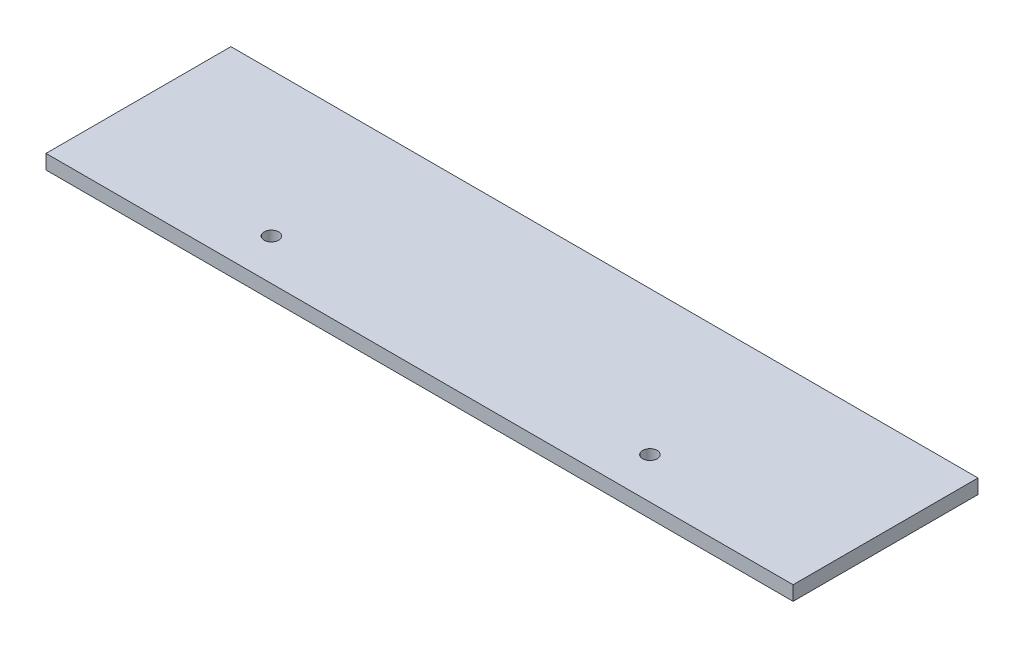
ISO-10303-21;
HEADER;
FILE_DESCRIPTION(('STEP AP214'),'2;1');
FILE_NAME('part.step','',(''),(''),'','','');
FILE_SCHEMA(('AUTOMOTIVE_DESIGN { 1 0 10303 214 1 1 1 1 }'));
ENDSEC;
DATA;
#1=APPLICATION_CONTEXT('core data for automotive mechanical design processes');
#2=APPLICATION_PROTOCOL_DEFINITION('international standard','automotive_design',2000,#1);
#3=PRODUCT_CONTEXT('',#1,'mechanical');
#4=PRODUCT('Part','Part','',(#3));
#5=PRODUCT_RELATED_PRODUCT_CATEGORY('part','',(#4));
#6=PRODUCT_DEFINITION_FORMATION('','',#4);
#7=PRODUCT_DEFINITION_CONTEXT('part definition',#1,'design');
#8=PRODUCT_DEFINITION('design','',#6,#7);
#9=PRODUCT_DEFINITION_SHAPE('','',#8);
#10=(LENGTH_UNIT() NAMED_UNIT(*) SI_UNIT(.MILLI.,.METRE.));
#11=(NAMED_UNIT(*) PLANE_ANGLE_UNIT() SI_UNIT($,.RADIAN.));
#12=(NAMED_UNIT(*) SI_UNIT($,.STERADIAN.) SOLID_ANGLE_UNIT());
#13=UNCERTAINTY_MEASURE_WITH_UNIT(LENGTH_MEASURE(1.E-05),#10,'distance_accuracy_value','');
#14=(GEOMETRIC_REPRESENTATION_CONTEXT(3) GLOBAL_UNCERTAINTY_ASSIGNED_CONTEXT((#13)) GLOBAL_UNIT_ASSIGNED_CONTEXT((#10,
#11,#12)) REPRESENTATION_CONTEXT('',''));
#15=CARTESIAN_POINT('',(0.,0.,0.));
#16=DIRECTION('',(0.,0.,1.));
#17=DIRECTION('',(1.,0.,0.));
#18=AXIS2_PLACEMENT_3D('',#15,#16,#17);
#19=CARTESIAN_POINT('',(0.,2.9718,0.));
#20=DIRECTION('',(0.,-1.,0.));
#21=DIRECTION('',(0.,0.,-1.));
#22=AXIS2_PLACEMENT_3D('',#19,#20,#21);
#23=PLANE('',#22);
#24=DIRECTION('',(0.,0.,1.));
#25=VECTOR('',#24,1.);
#26=CARTESIAN_POINT('',(0.,2.9718,0.));
#27=LINE('',#26,#25);
#28=CARTESIAN_POINT('',(0.,2.9718,-38.1));
#29=VERTEX_POINT('',#28);
#30=CARTESIAN_POINT('',(0.,2.9718,0.));
#31=VERTEX_POINT('',#30);
#32=EDGE_CURVE('E89',#29,#31,#27,.T.);
#33=ORIENTED_EDGE('',*,*,#32,.T.);
#34=DIRECTION('',(1.,0.,0.));
#35=VECTOR('',#34,1.);
#36=CARTESIAN_POINT('',(0.,2.9718,0.));
#37=LINE('',#36,#35);
#38=CARTESIAN_POINT('',(153.9436,2.9718,0.));
#39=VERTEX_POINT('',#38);
#40=EDGE_CURVE('E84',#31,#39,#37,.T.);
#41=ORIENTED_EDGE('',*,*,#40,.T.);
#42=DIRECTION('',(0.,0.,-1.));
#43=VECTOR('',#42,1.);
#44=CARTESIAN_POINT('',(153.9436,2.9718,0.));
#45=LINE('',#44,#43);
#46=CARTESIAN_POINT('',(153.9436,2.9718,-38.1));
#47=VERTEX_POINT('',#46);
#48=EDGE_CURVE('E87',#39,#47,#45,.T.);
#49=ORIENTED_EDGE('',*,*,#48,.T.);
#50=DIRECTION('',(-1.,0.,0.));
#51=VECTOR('',#50,1.);
#52=CARTESIAN_POINT('',(0.,2.9718,-38.1));
#53=LINE('',#52,#51);
#54=EDGE_CURVE('E54',#47,#29,#53,.T.);
#55=ORIENTED_EDGE('',*,*,#54,.T.);
#56=EDGE_LOOP('',(#33,#41,#49,#55));
#57=FACE_BOUND('',#56,.T.);
#58=CARTESIAN_POINT('',(37.9718,2.9718,-8.4718));
#59=DIRECTION('',(0.,1.,0.));
#60=DIRECTION('',(0.,0.,1.));
#61=AXIS2_PLACEMENT_3D('',#58,#59,#60);
#62=CIRCLE('',#61,1.5);
#63=CARTESIAN_POINT('',(37.9718,2.9718,-6.9718));
#64=VERTEX_POINT('',#63);
#65=EDGE_CURVE('E104',#64,#64,#62,.T.);
#66=ORIENTED_EDGE('',*,*,#65,.F.);
#67=EDGE_LOOP('',(#66));
#68=FACE_BOUND('',#67,.T.);
#69=CARTESIAN_POINT('',(115.9718,2.9718,-8.4718));
#70=DIRECTION('',(0.,1.,0.));
#71=DIRECTION('',(0.,0.,1.));
#72=AXIS2_PLACEMENT_3D('',#69,#70,#71);
#73=CIRCLE('',#72,1.5);
#74=CARTESIAN_POINT('',(115.9718,2.9718,-6.9718));
#75=VERTEX_POINT('',#74);
#76=EDGE_CURVE('E119',#75,#75,#73,.T.);
#77=ORIENTED_EDGE('',*,*,#76,.F.);
#78=EDGE_LOOP('',(#77));
#79=FACE_BOUND('',#78,.T.);
#80=ADVANCED_FACE('F37',(#57,#68,#79),#23,.F.);
#81=CARTESIAN_POINT('',(0.,0.,0.));
#82=DIRECTION('',(0.,-1.,0.));
#83=DIRECTION('',(0.,0.,-1.));
#84=AXIS2_PLACEMENT_3D('',#81,#82,#83);
#85=PLANE('',#84);
#86=CARTESIAN_POINT('',(37.9718,0.,-8.4718));
#87=DIRECTION('',(0.,1.,0.));
#88=DIRECTION('',(0.,0.,1.));
#89=AXIS2_PLACEMENT_3D('',#86,#87,#88);
#90=CIRCLE('',#89,1.5);
#91=CARTESIAN_POINT('',(37.9718,0.,-6.9718));
#92=VERTEX_POINT('',#91);
#93=EDGE_CURVE('E116',#92,#92,#90,.T.);
#94=ORIENTED_EDGE('',*,*,#93,.T.);
#95=EDGE_LOOP('',(#94));
#96=FACE_BOUND('',#95,.T.);
#97=DIRECTION('',(0.,0.,1.));
#98=VECTOR('',#97,1.);
#99=CARTESIAN_POINT('',(0.,0.,0.));
#100=LINE('',#99,#98);
#101=CARTESIAN_POINT('',(0.,0.,-38.1));
#102=VERTEX_POINT('',#101);
#103=CARTESIAN_POINT('',(0.,0.,0.));
#104=VERTEX_POINT('',#103);
#105=EDGE_CURVE('E101',#102,#104,#100,.T.);
#106=ORIENTED_EDGE('',*,*,#105,.F.);
#107=DIRECTION('',(-1.,0.,0.));
#108=VECTOR('',#107,1.);
#109=CARTESIAN_POINT('',(0.,0.,-38.1));
#110=LINE('',#109,#108);
#111=CARTESIAN_POINT('',(153.9436,0.,-38.1));
#112=VERTEX_POINT('',#111);
#113=EDGE_CURVE('E77',#112,#102,#110,.T.);
#114=ORIENTED_EDGE('',*,*,#113,.F.);
#115=DIRECTION('',(0.,0.,-1.));
#116=VECTOR('',#115,1.);
#117=CARTESIAN_POINT('',(153.9436,0.,0.));
#118=LINE('',#117,#116);
#119=CARTESIAN_POINT('',(153.9436,0.,0.));
#120=VERTEX_POINT('',#119);
#121=EDGE_CURVE('E71',#120,#112,#118,.T.);
#122=ORIENTED_EDGE('',*,*,#121,.F.);
#123=DIRECTION('',(1.,0.,0.));
#124=VECTOR('',#123,1.);
#125=CARTESIAN_POINT('',(0.,0.,0.));
#126=LINE('',#125,#124);
#127=EDGE_CURVE('E93',#104,#120,#126,.T.);
#128=ORIENTED_EDGE('',*,*,#127,.F.);
#129=EDGE_LOOP('',(#106,#114,#122,#128));
#130=FACE_BOUND('',#129,.T.);
#131=CARTESIAN_POINT('',(115.9718,0.,-8.4718));
#132=DIRECTION('',(0.,1.,0.));
#133=DIRECTION('',(0.,0.,1.));
#134=AXIS2_PLACEMENT_3D('',#131,#132,#133);
#135=CIRCLE('',#134,1.5);
#136=CARTESIAN_POINT('',(115.9718,0.,-6.9718));
#137=VERTEX_POINT('',#136);
#138=EDGE_CURVE('E122',#137,#137,#135,.T.);
#139=ORIENTED_EDGE('',*,*,#138,.T.);
#140=EDGE_LOOP('',(#139));
#141=FACE_BOUND('',#140,.T.);
#142=ADVANCED_FACE('F112',(#96,#130,#141),#85,.T.);
#143=CARTESIAN_POINT('',(0.,2.9718,0.));
#144=DIRECTION('',(1.,0.,0.));
#145=DIRECTION('',(0.,0.,-1.));
#146=AXIS2_PLACEMENT_3D('',#143,#144,#145);
#147=PLANE('',#146);
#148=ORIENTED_EDGE('',*,*,#105,.T.);
#149=DIRECTION('',(0.,-1.,0.));
#150=VECTOR('',#149,1.);
#151=CARTESIAN_POINT('',(0.,2.9718,0.));
#152=LINE('',#151,#150);
#153=EDGE_CURVE('E11',#31,#104,#152,.T.);
#154=ORIENTED_EDGE('',*,*,#153,.F.);
#155=ORIENTED_EDGE('',*,*,#32,.F.);
#156=DIRECTION('',(0.,-1.,0.));
#157=VECTOR('',#156,1.);
#158=CARTESIAN_POINT('',(0.,2.9718,-38.1));
#159=LINE('',#158,#157);
#160=EDGE_CURVE('E97',#29,#102,#159,.T.);
#161=ORIENTED_EDGE('',*,*,#160,.T.);
#162=EDGE_LOOP('',(#148,#154,#155,#161));
#163=FACE_BOUND('',#162,.T.);
#164=ADVANCED_FACE('F39',(#163),#147,.F.);
#165=CARTESIAN_POINT('',(0.,2.9718,0.));
#166=DIRECTION('',(0.,0.,-1.));
#167=DIRECTION('',(-1.,0.,0.));
#168=AXIS2_PLACEMENT_3D('',#165,#166,#167);
#169=PLANE('',#168);
#170=ORIENTED_EDGE('',*,*,#127,.T.);
#171=DIRECTION('',(0.,-1.,0.));
#172=VECTOR('',#171,1.);
#173=CARTESIAN_POINT('',(153.9436,2.9718,0.));
#174=LINE('',#173,#172);
#175=EDGE_CURVE('E46',#39,#120,#174,.T.);
#176=ORIENTED_EDGE('',*,*,#175,.F.);
#177=ORIENTED_EDGE('',*,*,#40,.F.);
#178=ORIENTED_EDGE('',*,*,#153,.T.);
#179=EDGE_LOOP('',(#170,#176,#177,#178));
#180=FACE_BOUND('',#179,.T.);
#181=ADVANCED_FACE('F92',(#180),#169,.F.);
#182=CARTESIAN_POINT('',(153.9436,2.9718,0.));
#183=DIRECTION('',(-1.,0.,0.));
#184=DIRECTION('',(0.,0.,1.));
#185=AXIS2_PLACEMENT_3D('',#182,#183,#184);
#186=PLANE('',#185);
#187=ORIENTED_EDGE('',*,*,#121,.T.);
#188=DIRECTION('',(0.,-1.,0.));
#189=VECTOR('',#188,1.);
#190=CARTESIAN_POINT('',(153.9436,2.9718,-38.1));
#191=LINE('',#190,#189);
#192=EDGE_CURVE('E94',#47,#112,#191,.T.);
#193=ORIENTED_EDGE('',*,*,#192,.F.);
#194=ORIENTED_EDGE('',*,*,#48,.F.);
#195=ORIENTED_EDGE('',*,*,#175,.T.);
#196=EDGE_LOOP('',(#187,#193,#194,#195));
#197=FACE_BOUND('',#196,.T.);
#198=ADVANCED_FACE('F95',(#197),#186,.F.);
#199=CARTESIAN_POINT('',(0.,2.9718,-38.1));
#200=DIRECTION('',(0.,0.,1.));
#201=DIRECTION('',(1.,0.,0.));
#202=AXIS2_PLACEMENT_3D('',#199,#200,#201);
#203=PLANE('',#202);
#204=ORIENTED_EDGE('',*,*,#113,.T.);
#205=ORIENTED_EDGE('',*,*,#160,.F.);
#206=ORIENTED_EDGE('',*,*,#54,.F.);
#207=ORIENTED_EDGE('',*,*,#192,.T.);
#208=EDGE_LOOP('',(#204,#205,#206,#207));
#209=FACE_BOUND('',#208,.T.);
#210=ADVANCED_FACE('F109',(#209),#203,.F.);
#211=CARTESIAN_POINT('',(37.9718,2.9718,-8.4718));
#212=DIRECTION('',(0.,-1.,0.));
#213=DIRECTION('',(0.,0.,-1.));
#214=AXIS2_PLACEMENT_3D('',#211,#212,#213);
#215=CYLINDRICAL_SURFACE('',#214,1.5);
#216=ORIENTED_EDGE('',*,*,#65,.T.);
#217=EDGE_LOOP('',(#216));
#218=FACE_BOUND('',#217,.T.);
#219=ORIENTED_EDGE('',*,*,#93,.F.);
#220=EDGE_LOOP('',(#219));
#221=FACE_BOUND('',#220,.T.);
#222=ADVANCED_FACE('F139',(#218,#221),#215,.F.);
#223=CARTESIAN_POINT('',(115.9718,2.9718,-8.4718));
#224=DIRECTION('',(0.,-1.,0.));
#225=DIRECTION('',(0.,0.,-1.));
#226=AXIS2_PLACEMENT_3D('',#223,#224,#225);
#227=CYLINDRICAL_SURFACE('',#226,1.5);
#228=ORIENTED_EDGE('',*,*,#76,.T.);
#229=EDGE_LOOP('',(#228));
#230=FACE_BOUND('',#229,.T.);
#231=ORIENTED_EDGE('',*,*,#138,.F.);
#232=EDGE_LOOP('',(#231));
#233=FACE_BOUND('',#232,.T.);
#234=ADVANCED_FACE('F128',(#230,#233),#227,.F.);
#235=CLOSED_SHELL('',(#80,#142,#164,#181,#198,#210,#222,#234));
#236=MANIFOLD_SOLID_BREP('B2',#235);
#237=ADVANCED_BREP_SHAPE_REPRESENTATION('',(#18,#236),#14);
#238=SHAPE_DEFINITION_REPRESENTATION(#9,#237);
ENDSEC;
END-ISO-10303-21;
